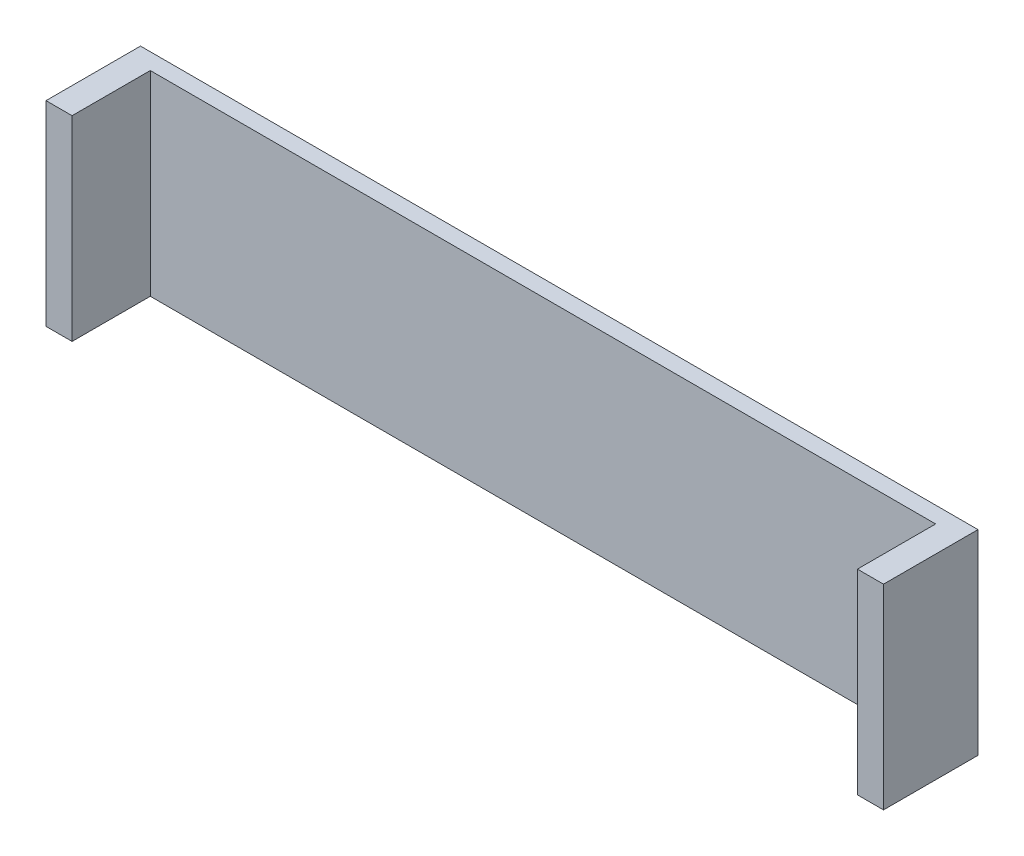
ISO-10303-21;
HEADER;
FILE_DESCRIPTION(('STEP AP214'),'2;1');
FILE_NAME('part.step','',(''),(''),'','','');
FILE_SCHEMA(('AUTOMOTIVE_DESIGN { 1 0 10303 214 1 1 1 1 }'));
ENDSEC;
DATA;
#1=APPLICATION_CONTEXT('core data for automotive mechanical design processes');
#2=APPLICATION_PROTOCOL_DEFINITION('international standard','automotive_design',2000,#1);
#3=PRODUCT_CONTEXT('',#1,'mechanical');
#4=PRODUCT('Part','Part','',(#3));
#5=PRODUCT_RELATED_PRODUCT_CATEGORY('part','',(#4));
#6=PRODUCT_DEFINITION_FORMATION('','',#4);
#7=PRODUCT_DEFINITION_CONTEXT('part definition',#1,'design');
#8=PRODUCT_DEFINITION('design','',#6,#7);
#9=PRODUCT_DEFINITION_SHAPE('','',#8);
#10=(LENGTH_UNIT() NAMED_UNIT(*) SI_UNIT(.MILLI.,.METRE.));
#11=(NAMED_UNIT(*) PLANE_ANGLE_UNIT() SI_UNIT($,.RADIAN.));
#12=(NAMED_UNIT(*) SI_UNIT($,.STERADIAN.) SOLID_ANGLE_UNIT());
#13=UNCERTAINTY_MEASURE_WITH_UNIT(LENGTH_MEASURE(1.E-05),#10,'distance_accuracy_value','');
#14=(GEOMETRIC_REPRESENTATION_CONTEXT(3) GLOBAL_UNCERTAINTY_ASSIGNED_CONTEXT((#13)) GLOBAL_UNIT_ASSIGNED_CONTEXT((#10,
#11,#12)) REPRESENTATION_CONTEXT('',''));
#15=CARTESIAN_POINT('',(0.,0.,0.));
#16=DIRECTION('',(0.,0.,1.));
#17=DIRECTION('',(1.,0.,0.));
#18=AXIS2_PLACEMENT_3D('',#15,#16,#17);
#19=CARTESIAN_POINT('',(0.,0.,0.));
#20=DIRECTION('',(0.,0.,-1.));
#21=DIRECTION('',(-1.,0.,0.));
#22=AXIS2_PLACEMENT_3D('',#19,#20,#21);
#23=PLANE('',#22);
#24=DIRECTION('',(0.,-1.,0.));
#25=VECTOR('',#24,1.);
#26=CARTESIAN_POINT('',(225.483182640145,0.,0.));
#27=LINE('',#26,#25);
#28=CARTESIAN_POINT('',(225.483182640145,35.5478546769686,0.));
#29=VERTEX_POINT('',#28);
#30=CARTESIAN_POINT('',(225.483182640145,-24.4521453230314,0.));
#31=VERTEX_POINT('',#30);
#32=EDGE_CURVE('E121',#29,#31,#27,.T.);
#33=ORIENTED_EDGE('',*,*,#32,.F.);
#34=DIRECTION('',(1.,0.,0.));
#35=VECTOR('',#34,1.);
#36=CARTESIAN_POINT('',(-23.5168173598553,35.5478546769686,0.));
#37=LINE('',#36,#35);
#38=CARTESIAN_POINT('',(-15.5168173598553,35.5478546769686,0.));
#39=VERTEX_POINT('',#38);
#40=EDGE_CURVE('E103',#39,#29,#37,.T.);
#41=ORIENTED_EDGE('',*,*,#40,.F.);
#42=DIRECTION('',(0.,-1.,0.));
#43=VECTOR('',#42,1.);
#44=CARTESIAN_POINT('',(-15.5168173598553,0.,0.));
#45=LINE('',#44,#43);
#46=CARTESIAN_POINT('',(-15.5168173598553,-24.4521453230314,0.));
#47=VERTEX_POINT('',#46);
#48=EDGE_CURVE('E145',#39,#47,#45,.T.);
#49=ORIENTED_EDGE('',*,*,#48,.T.);
#50=DIRECTION('',(-1.,0.,0.));
#51=VECTOR('',#50,1.);
#52=CARTESIAN_POINT('',(-23.5168173598553,-24.4521453230314,0.));
#53=LINE('',#52,#51);
#54=EDGE_CURVE('E132',#31,#47,#53,.T.);
#55=ORIENTED_EDGE('',*,*,#54,.F.);
#56=EDGE_LOOP('',(#33,#41,#49,#55));
#57=FACE_BOUND('',#56,.T.);
#58=ADVANCED_FACE('F36',(#57),#23,.F.);
#59=CARTESIAN_POINT('',(0.,35.5478546769686,24.));
#60=DIRECTION('',(0.,1.,0.));
#61=DIRECTION('',(0.,0.,1.));
#62=AXIS2_PLACEMENT_3D('',#59,#60,#61);
#63=PLANE('',#62);
#64=DIRECTION('',(0.,0.,-1.));
#65=VECTOR('',#64,1.);
#66=CARTESIAN_POINT('',(-15.5168173598553,35.5478546769686,24.));
#67=LINE('',#66,#65);
#68=CARTESIAN_POINT('',(-15.5168173598553,35.5478546769686,24.));
#69=VERTEX_POINT('',#68);
#70=EDGE_CURVE('E52',#69,#39,#67,.T.);
#71=ORIENTED_EDGE('',*,*,#70,.T.);
#72=ORIENTED_EDGE('',*,*,#40,.T.);
#73=DIRECTION('',(0.,0.,-1.));
#74=VECTOR('',#73,1.);
#75=CARTESIAN_POINT('',(225.483182640145,35.5478546769686,24.));
#76=LINE('',#75,#74);
#77=CARTESIAN_POINT('',(225.483182640145,35.5478546769686,24.));
#78=VERTEX_POINT('',#77);
#79=EDGE_CURVE('E97',#78,#29,#76,.T.);
#80=ORIENTED_EDGE('',*,*,#79,.F.);
#81=DIRECTION('',(1.,0.,0.));
#82=VECTOR('',#81,1.);
#83=CARTESIAN_POINT('',(0.,35.5478546769686,24.));
#84=LINE('',#83,#82);
#85=CARTESIAN_POINT('',(233.483182640145,35.5478546769686,24.));
#86=VERTEX_POINT('',#85);
#87=EDGE_CURVE('E101',#78,#86,#84,.T.);
#88=ORIENTED_EDGE('',*,*,#87,.T.);
#89=DIRECTION('',(0.,0.,1.));
#90=VECTOR('',#89,1.);
#91=CARTESIAN_POINT('',(233.483182640145,35.5478546769686,-5.));
#92=LINE('',#91,#90);
#93=CARTESIAN_POINT('',(233.483182640145,35.5478546769686,-5.));
#94=VERTEX_POINT('',#93);
#95=EDGE_CURVE('E143',#94,#86,#92,.T.);
#96=ORIENTED_EDGE('',*,*,#95,.F.);
#97=DIRECTION('',(1.,0.,0.));
#98=VECTOR('',#97,1.);
#99=CARTESIAN_POINT('',(-23.5168173598553,35.5478546769686,-5.));
#100=LINE('',#99,#98);
#101=CARTESIAN_POINT('',(-23.5168173598553,35.5478546769686,-5.));
#102=VERTEX_POINT('',#101);
#103=EDGE_CURVE('E131',#102,#94,#100,.T.);
#104=ORIENTED_EDGE('',*,*,#103,.F.);
#105=DIRECTION('',(0.,0.,-1.));
#106=VECTOR('',#105,1.);
#107=CARTESIAN_POINT('',(-23.5168173598553,35.5478546769686,24.));
#108=LINE('',#107,#106);
#109=CARTESIAN_POINT('',(-23.5168173598553,35.5478546769686,24.));
#110=VERTEX_POINT('',#109);
#111=EDGE_CURVE('E11',#110,#102,#108,.T.);
#112=ORIENTED_EDGE('',*,*,#111,.F.);
#113=DIRECTION('',(1.,0.,0.));
#114=VECTOR('',#113,1.);
#115=CARTESIAN_POINT('',(0.,35.5478546769686,24.));
#116=LINE('',#115,#114);
#117=EDGE_CURVE('E146',#110,#69,#116,.T.);
#118=ORIENTED_EDGE('',*,*,#117,.T.);
#119=EDGE_LOOP('',(#71,#72,#80,#88,#96,#104,#112,#118));
#120=FACE_BOUND('',#119,.T.);
#121=ADVANCED_FACE('F38',(#120),#63,.T.);
#122=CARTESIAN_POINT('',(-23.5168173598553,0.,24.));
#123=DIRECTION('',(-1.,0.,0.));
#124=DIRECTION('',(0.,0.,1.));
#125=AXIS2_PLACEMENT_3D('',#122,#123,#124);
#126=PLANE('',#125);
#127=ORIENTED_EDGE('',*,*,#111,.T.);
#128=DIRECTION('',(0.,1.,0.));
#129=VECTOR('',#128,1.);
#130=CARTESIAN_POINT('',(-23.5168173598553,-24.4521453230314,-5.));
#131=LINE('',#130,#129);
#132=CARTESIAN_POINT('',(-23.5168173598553,-24.4521453230314,-5.));
#133=VERTEX_POINT('',#132);
#134=EDGE_CURVE('E128',#133,#102,#131,.T.);
#135=ORIENTED_EDGE('',*,*,#134,.F.);
#136=DIRECTION('',(0.,0.,-1.));
#137=VECTOR('',#136,1.);
#138=CARTESIAN_POINT('',(-23.5168173598553,-24.4521453230314,24.));
#139=LINE('',#138,#137);
#140=CARTESIAN_POINT('',(-23.5168173598553,-24.4521453230314,24.));
#141=VERTEX_POINT('',#140);
#142=EDGE_CURVE('E45',#141,#133,#139,.T.);
#143=ORIENTED_EDGE('',*,*,#142,.F.);
#144=DIRECTION('',(0.,1.,0.));
#145=VECTOR('',#144,1.);
#146=CARTESIAN_POINT('',(-23.5168173598553,0.,24.));
#147=LINE('',#146,#145);
#148=EDGE_CURVE('E148',#141,#110,#147,.T.);
#149=ORIENTED_EDGE('',*,*,#148,.T.);
#150=EDGE_LOOP('',(#127,#135,#143,#149));
#151=FACE_BOUND('',#150,.T.);
#152=ADVANCED_FACE('F172',(#151),#126,.T.);
#153=CARTESIAN_POINT('',(0.,-24.4521453230314,24.));
#154=DIRECTION('',(0.,1.,0.));
#155=DIRECTION('',(0.,0.,1.));
#156=AXIS2_PLACEMENT_3D('',#153,#154,#155);
#157=PLANE('',#156);
#158=ORIENTED_EDGE('',*,*,#142,.T.);
#159=DIRECTION('',(-1.,0.,0.));
#160=VECTOR('',#159,1.);
#161=CARTESIAN_POINT('',(-23.5168173598553,-24.4521453230314,-5.));
#162=LINE('',#161,#160);
#163=CARTESIAN_POINT('',(233.483182640145,-24.4521453230314,-5.));
#164=VERTEX_POINT('',#163);
#165=EDGE_CURVE('E136',#164,#133,#162,.T.);
#166=ORIENTED_EDGE('',*,*,#165,.F.);
#167=DIRECTION('',(0.,0.,1.));
#168=VECTOR('',#167,1.);
#169=CARTESIAN_POINT('',(233.483182640145,-24.4521453230314,-5.));
#170=LINE('',#169,#168);
#171=CARTESIAN_POINT('',(233.483182640145,-24.4521453230314,24.));
#172=VERTEX_POINT('',#171);
#173=EDGE_CURVE('E139',#164,#172,#170,.T.);
#174=ORIENTED_EDGE('',*,*,#173,.T.);
#175=DIRECTION('',(1.,0.,0.));
#176=VECTOR('',#175,1.);
#177=CARTESIAN_POINT('',(0.,-24.4521453230314,24.));
#178=LINE('',#177,#176);
#179=CARTESIAN_POINT('',(225.483182640145,-24.4521453230314,24.));
#180=VERTEX_POINT('',#179);
#181=EDGE_CURVE('E115',#180,#172,#178,.T.);
#182=ORIENTED_EDGE('',*,*,#181,.F.);
#183=DIRECTION('',(0.,0.,-1.));
#184=VECTOR('',#183,1.);
#185=CARTESIAN_POINT('',(225.483182640145,-24.4521453230314,24.));
#186=LINE('',#185,#184);
#187=EDGE_CURVE('E106',#180,#31,#186,.T.);
#188=ORIENTED_EDGE('',*,*,#187,.T.);
#189=ORIENTED_EDGE('',*,*,#54,.T.);
#190=DIRECTION('',(0.,0.,-1.));
#191=VECTOR('',#190,1.);
#192=CARTESIAN_POINT('',(-15.5168173598553,-24.4521453230314,24.));
#193=LINE('',#192,#191);
#194=CARTESIAN_POINT('',(-15.5168173598553,-24.4521453230314,24.));
#195=VERTEX_POINT('',#194);
#196=EDGE_CURVE('E158',#195,#47,#193,.T.);
#197=ORIENTED_EDGE('',*,*,#196,.F.);
#198=DIRECTION('',(1.,0.,0.));
#199=VECTOR('',#198,1.);
#200=CARTESIAN_POINT('',(0.,-24.4521453230314,24.));
#201=LINE('',#200,#199);
#202=EDGE_CURVE('E151',#141,#195,#201,.T.);
#203=ORIENTED_EDGE('',*,*,#202,.F.);
#204=EDGE_LOOP('',(#158,#166,#174,#182,#188,#189,#197,#203));
#205=FACE_BOUND('',#204,.T.);
#206=ADVANCED_FACE('F163',(#205),#157,.F.);
#207=CARTESIAN_POINT('',(-15.5168173598553,0.,24.));
#208=DIRECTION('',(1.,0.,0.));
#209=DIRECTION('',(0.,1.,0.));
#210=AXIS2_PLACEMENT_3D('',#207,#208,#209);
#211=PLANE('',#210);
#212=ORIENTED_EDGE('',*,*,#48,.F.);
#213=ORIENTED_EDGE('',*,*,#70,.F.);
#214=DIRECTION('',(0.,-1.,0.));
#215=VECTOR('',#214,1.);
#216=CARTESIAN_POINT('',(-15.5168173598553,0.,24.));
#217=LINE('',#216,#215);
#218=EDGE_CURVE('E153',#69,#195,#217,.T.);
#219=ORIENTED_EDGE('',*,*,#218,.T.);
#220=ORIENTED_EDGE('',*,*,#196,.T.);
#221=EDGE_LOOP('',(#212,#213,#219,#220));
#222=FACE_BOUND('',#221,.T.);
#223=ADVANCED_FACE('F179',(#222),#211,.T.);
#224=CARTESIAN_POINT('',(0.,0.,24.));
#225=DIRECTION('',(0.,0.,1.));
#226=DIRECTION('',(1.,0.,0.));
#227=AXIS2_PLACEMENT_3D('',#224,#225,#226);
#228=PLANE('',#227);
#229=ORIENTED_EDGE('',*,*,#117,.F.);
#230=ORIENTED_EDGE('',*,*,#148,.F.);
#231=ORIENTED_EDGE('',*,*,#202,.T.);
#232=ORIENTED_EDGE('',*,*,#218,.F.);
#233=EDGE_LOOP('',(#229,#230,#231,#232));
#234=FACE_BOUND('',#233,.T.);
#235=ADVANCED_FACE('F182',(#234),#228,.T.);
#236=CARTESIAN_POINT('',(233.483182640145,-24.4521453230314,-5.));
#237=DIRECTION('',(-1.,0.,0.));
#238=DIRECTION('',(0.,0.,1.));
#239=AXIS2_PLACEMENT_3D('',#236,#237,#238);
#240=PLANE('',#239);
#241=ORIENTED_EDGE('',*,*,#95,.T.);
#242=DIRECTION('',(0.,1.,0.));
#243=VECTOR('',#242,1.);
#244=CARTESIAN_POINT('',(233.483182640145,0.,24.));
#245=LINE('',#244,#243);
#246=EDGE_CURVE('E120',#172,#86,#245,.T.);
#247=ORIENTED_EDGE('',*,*,#246,.F.);
#248=ORIENTED_EDGE('',*,*,#173,.F.);
#249=DIRECTION('',(0.,-1.,0.));
#250=VECTOR('',#249,1.);
#251=CARTESIAN_POINT('',(233.483182640145,-24.4521453230314,-5.));
#252=LINE('',#251,#250);
#253=EDGE_CURVE('E134',#94,#164,#252,.T.);
#254=ORIENTED_EDGE('',*,*,#253,.F.);
#255=EDGE_LOOP('',(#241,#247,#248,#254));
#256=FACE_BOUND('',#255,.T.);
#257=ADVANCED_FACE('F176',(#256),#240,.F.);
#258=CARTESIAN_POINT('',(0.,0.,-5.));
#259=DIRECTION('',(0.,0.,-1.));
#260=DIRECTION('',(-1.,0.,0.));
#261=AXIS2_PLACEMENT_3D('',#258,#259,#260);
#262=PLANE('',#261);
#263=ORIENTED_EDGE('',*,*,#134,.T.);
#264=ORIENTED_EDGE('',*,*,#103,.T.);
#265=ORIENTED_EDGE('',*,*,#253,.T.);
#266=ORIENTED_EDGE('',*,*,#165,.T.);
#267=EDGE_LOOP('',(#263,#264,#265,#266));
#268=FACE_BOUND('',#267,.T.);
#269=ADVANCED_FACE('F169',(#268),#262,.T.);
#270=CARTESIAN_POINT('',(225.483182640145,0.,24.));
#271=DIRECTION('',(1.,0.,0.));
#272=DIRECTION('',(0.,0.,-1.));
#273=AXIS2_PLACEMENT_3D('',#270,#271,#272);
#274=PLANE('',#273);
#275=ORIENTED_EDGE('',*,*,#32,.T.);
#276=ORIENTED_EDGE('',*,*,#187,.F.);
#277=DIRECTION('',(0.,-1.,0.));
#278=VECTOR('',#277,1.);
#279=CARTESIAN_POINT('',(225.483182640145,0.,24.));
#280=LINE('',#279,#278);
#281=EDGE_CURVE('E109',#78,#180,#280,.T.);
#282=ORIENTED_EDGE('',*,*,#281,.F.);
#283=ORIENTED_EDGE('',*,*,#79,.T.);
#284=EDGE_LOOP('',(#275,#276,#282,#283));
#285=FACE_BOUND('',#284,.T.);
#286=ADVANCED_FACE('F110',(#285),#274,.F.);
#287=CARTESIAN_POINT('',(0.,0.,24.));
#288=DIRECTION('',(0.,0.,1.));
#289=DIRECTION('',(1.,0.,0.));
#290=AXIS2_PLACEMENT_3D('',#287,#288,#289);
#291=PLANE('',#290);
#292=ORIENTED_EDGE('',*,*,#87,.F.);
#293=ORIENTED_EDGE('',*,*,#281,.T.);
#294=ORIENTED_EDGE('',*,*,#181,.T.);
#295=ORIENTED_EDGE('',*,*,#246,.T.);
#296=EDGE_LOOP('',(#292,#293,#294,#295));
#297=FACE_BOUND('',#296,.T.);
#298=ADVANCED_FACE('F118',(#297),#291,.T.);
#299=CLOSED_SHELL('',(#58,#121,#152,#206,#223,#235,#257,#269,#286,#298));
#300=MANIFOLD_SOLID_BREP('B2',#299);
#301=ADVANCED_BREP_SHAPE_REPRESENTATION('',(#18,#300),#14);
#302=SHAPE_DEFINITION_REPRESENTATION(#9,#301);
ENDSEC;
END-ISO-10303-21;
